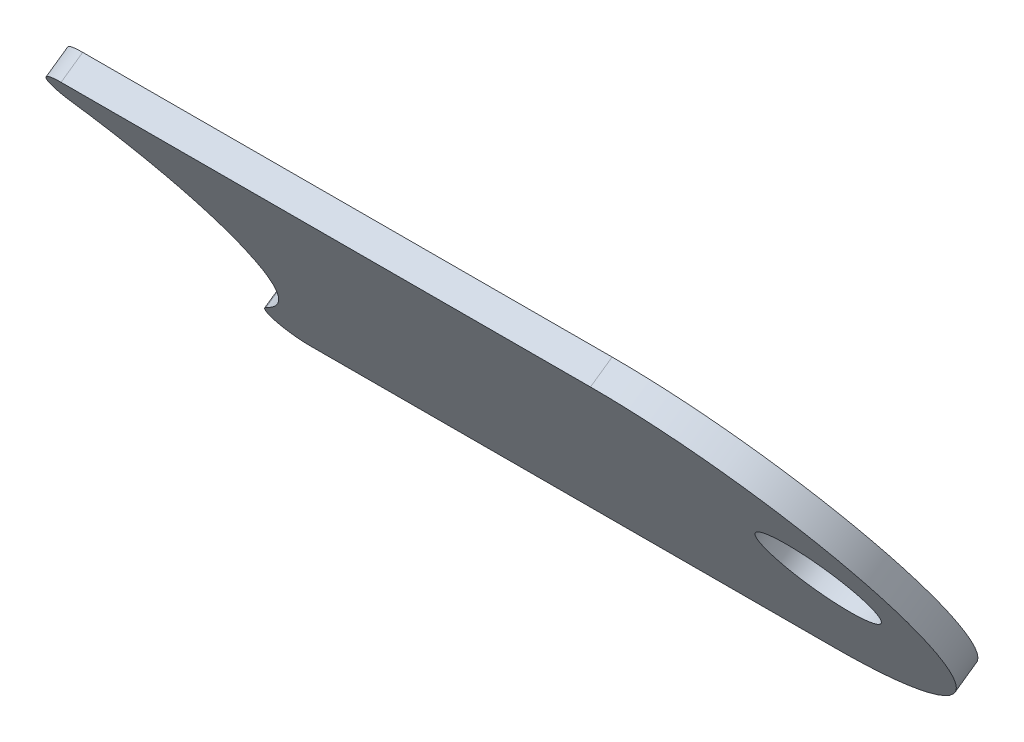
ISO-10303-21;
HEADER;
FILE_DESCRIPTION(('STEP AP214'),'2;1');
FILE_NAME('part.step','',(''),(''),'','','');
FILE_SCHEMA(('AUTOMOTIVE_DESIGN { 1 0 10303 214 1 1 1 1 }'));
ENDSEC;
DATA;
#1=APPLICATION_CONTEXT('core data for automotive mechanical design processes');
#2=APPLICATION_PROTOCOL_DEFINITION('international standard','automotive_design',2000,#1);
#3=PRODUCT_CONTEXT('',#1,'mechanical');
#4=PRODUCT('Part','Part','',(#3));
#5=PRODUCT_RELATED_PRODUCT_CATEGORY('part','',(#4));
#6=PRODUCT_DEFINITION_FORMATION('','',#4);
#7=PRODUCT_DEFINITION_CONTEXT('part definition',#1,'design');
#8=PRODUCT_DEFINITION('design','',#6,#7);
#9=PRODUCT_DEFINITION_SHAPE('','',#8);
#10=(LENGTH_UNIT() NAMED_UNIT(*) SI_UNIT(.MILLI.,.METRE.));
#11=(NAMED_UNIT(*) PLANE_ANGLE_UNIT() SI_UNIT($,.RADIAN.));
#12=(NAMED_UNIT(*) SI_UNIT($,.STERADIAN.) SOLID_ANGLE_UNIT());
#13=UNCERTAINTY_MEASURE_WITH_UNIT(LENGTH_MEASURE(1.E-05),#10,'distance_accuracy_value','');
#14=(GEOMETRIC_REPRESENTATION_CONTEXT(3) GLOBAL_UNCERTAINTY_ASSIGNED_CONTEXT((#13)) GLOBAL_UNIT_ASSIGNED_CONTEXT((#10,
#11,#12)) REPRESENTATION_CONTEXT('',''));
#15=CARTESIAN_POINT('',(0.,0.,0.));
#16=DIRECTION('',(0.,0.,1.));
#17=DIRECTION('',(1.,0.,0.));
#18=AXIS2_PLACEMENT_3D('',#15,#16,#17);
#19=CARTESIAN_POINT('',(369.178005994404,143.93863860398,-371.119079257776));
#20=DIRECTION('',(0.,0.57357643635105,-0.819152044288989));
#21=DIRECTION('',(0.,0.819152044288989,0.57357643635105));
#22=AXIS2_PLACEMENT_3D('',#19,#20,#21);
#23=PLANE('',#22);
#24=DIRECTION('',(-0.999979236342597,-0.00527872685333391,-0.00369620433485562));
#25=VECTOR('',#24,1.);
#26=CARTESIAN_POINT('',(369.25984481726,133.535839655271,-378.403197500141));
#27=LINE('',#26,#25);
#28=CARTESIAN_POINT('',(369.25984481726,133.535839655271,-378.403197500141));
#29=VERTEX_POINT('',#28);
#30=CARTESIAN_POINT('',(337.560977259532,133.368506517426,-378.520365424653));
#31=VERTEX_POINT('',#30);
#32=EDGE_CURVE('E141',#29,#31,#27,.T.);
#33=ORIENTED_EDGE('',*,*,#32,.T.);
#34=CARTESIAN_POINT('',(337.550747194261,134.668883386595,-377.609831738348));
#35=DIRECTION('',(0.,0.57357643635105,-0.819152044288989));
#36=DIRECTION('',(0.,0.819152044288989,0.57357643635105));
#37=AXIS2_PLACEMENT_3D('',#34,#35,#36);
#38=CIRCLE('',#37,1.5875);
#39=CARTESIAN_POINT('',(336.494102412081,135.639382583709,-376.930280884701));
#40=VERTEX_POINT('',#39);
#41=EDGE_CURVE('E219',#31,#40,#38,.T.);
#42=ORIENTED_EDGE('',*,*,#41,.T.);
#43=CARTESIAN_POINT('',(328.095275038634,143.527103450277,-371.407239274637));
#44=DIRECTION('',(0.,0.57357643635105,-0.819152044288989));
#45=DIRECTION('',(-0.0176869954539416,-0.819023906678444,-0.573486713430218));
#46=AXIS2_PLACEMENT_3D('',#43,#44,#45);
#47=ELLIPSE('',#46,12.841585507469,12.7);
#48=CARTESIAN_POINT('',(340.793288413971,143.343101551537,-371.536078791179));
#49=VERTEX_POINT('',#48);
#50=EDGE_CURVE('E123',#49,#40,#47,.T.);
#51=ORIENTED_EDGE('',*,*,#50,.F.);
#52=CARTESIAN_POINT('',(340.794846700172,143.440453597532,-371.467912154752));
#53=VERTEX_POINT('',#52);
#54=EDGE_CURVE('E115',#53,#49,#47,.T.);
#55=ORIENTED_EDGE('',*,*,#54,.F.);
#56=CARTESIAN_POINT('',(328.099479374518,143.721791779883,-371.270917038645));
#57=DIRECTION('',(0.,-0.57357643635105,0.819152044288989));
#58=DIRECTION('',(-0.0176869954539423,-0.819023906678444,-0.573486713430218));
#59=AXIS2_PLACEMENT_3D('',#56,#57,#58);
#60=ELLIPSE('',#59,12.841585507469,12.7);
#61=CARTESIAN_POINT('',(336.135855829977,151.86970256596,-365.565688485574));
#62=VERTEX_POINT('',#61);
#63=EDGE_CURVE('E102',#62,#53,#60,.F.);
#64=ORIENTED_EDGE('',*,*,#63,.F.);
#65=CARTESIAN_POINT('',(337.146776750509,152.872351073607,-364.863626442344));
#66=DIRECTION('',(0.,0.57357643635105,-0.819152044288989));
#67=DIRECTION('',(0.,0.819152044288989,0.57357643635105));
#68=AXIS2_PLACEMENT_3D('',#65,#66,#67);
#69=CIRCLE('',#68,1.5875);
#70=CARTESIAN_POINT('',(337.136546685238,154.172727942776,-363.953092756039));
#71=VERTEX_POINT('',#70);
#72=EDGE_CURVE('E212',#62,#71,#69,.T.);
#73=ORIENTED_EDGE('',*,*,#72,.T.);
#74=DIRECTION('',(0.999979236342597,0.00527872685333337,0.00369620433485488));
#75=VECTOR('',#74,1.);
#76=CARTESIAN_POINT('',(328.099479374518,154.125022742353,-363.986496296987));
#77=LINE('',#76,#75);
#78=CARTESIAN_POINT('',(369.096167171547,154.341437552688,-363.83496101541));
#79=VERTEX_POINT('',#78);
#80=EDGE_CURVE('E136',#71,#79,#77,.T.);
#81=ORIENTED_EDGE('',*,*,#80,.T.);
#82=CARTESIAN_POINT('',(369.178005994404,143.93863860398,-371.119079257776));
#83=DIRECTION('',(0.,0.57357643635105,-0.819152044288989));
#84=DIRECTION('',(0.,0.819152044288989,0.57357643635105));
#85=AXIS2_PLACEMENT_3D('',#82,#83,#84);
#86=CIRCLE('',#85,12.699736301551);
#87=EDGE_CURVE('E138',#79,#29,#86,.T.);
#88=ORIENTED_EDGE('',*,*,#87,.T.);
#89=EDGE_LOOP('',(#33,#42,#51,#55,#64,#73,#81,#88));
#90=FACE_BOUND('',#89,.T.);
#91=CARTESIAN_POINT('',(375.527742298692,143.972157823502,-371.095608847591));
#92=DIRECTION('',(0.,0.57357643635105,-0.819152044288989));
#93=DIRECTION('',(0.,0.819152044288989,0.57357643635105));
#94=AXIS2_PLACEMENT_3D('',#91,#92,#93);
#95=CIRCLE('',#94,3.30200000000005);
#96=CARTESIAN_POINT('',(375.527742298692,146.676997873744,-369.20165945476));
#97=VERTEX_POINT('',#96);
#98=EDGE_CURVE('E127',#97,#97,#95,.T.);
#99=ORIENTED_EDGE('',*,*,#98,.F.);
#100=EDGE_LOOP('',(#99));
#101=FACE_BOUND('',#100,.T.);
#102=ADVANCED_FACE('F38',(#90,#101),#23,.T.);
#103=CARTESIAN_POINT('',(369.178005994404,143.028086011272,-369.818675387467));
#104=DIRECTION('',(0.,0.57357643635105,-0.819152044288989));
#105=DIRECTION('',(0.,0.819152044288989,0.57357643635105));
#106=AXIS2_PLACEMENT_3D('',#103,#104,#105);
#107=PLANE('',#106);
#108=CARTESIAN_POINT('',(328.095275038634,142.61655085757,-370.106835404328));
#109=DIRECTION('',(0.,0.57357643635105,-0.819152044288989));
#110=DIRECTION('',(-0.0176869954539423,-0.819023906678444,-0.573486713430218));
#111=AXIS2_PLACEMENT_3D('',#108,#109,#110);
#112=ELLIPSE('',#111,12.841585507469,12.7);
#113=CARTESIAN_POINT('',(340.794846700172,142.529901004807,-370.167508284417));
#114=VERTEX_POINT('',#113);
#115=CARTESIAN_POINT('',(336.494102412081,134.728829991002,-375.629877014393));
#116=VERTEX_POINT('',#115);
#117=EDGE_CURVE('E110',#114,#116,#112,.T.);
#118=ORIENTED_EDGE('',*,*,#117,.T.);
#119=CARTESIAN_POINT('',(337.550747194261,133.758330793887,-376.309427868039));
#120=DIRECTION('',(0.,0.57357643635105,-0.819152044288989));
#121=DIRECTION('',(0.,0.819152044288989,0.57357643635105));
#122=AXIS2_PLACEMENT_3D('',#119,#120,#121);
#123=CIRCLE('',#122,1.5875);
#124=CARTESIAN_POINT('',(337.560977259532,132.457953924719,-377.219961554344));
#125=VERTEX_POINT('',#124);
#126=EDGE_CURVE('E213',#116,#125,#123,.F.);
#127=ORIENTED_EDGE('',*,*,#126,.T.);
#128=DIRECTION('',(-0.999979236342597,-0.00527872685333391,-0.00369620433485562));
#129=VECTOR('',#128,1.);
#130=CARTESIAN_POINT('',(369.25984481726,132.625287062564,-377.102793629832));
#131=LINE('',#130,#129);
#132=CARTESIAN_POINT('',(369.25984481726,132.625287062564,-377.102793629832));
#133=VERTEX_POINT('',#132);
#134=EDGE_CURVE('E139',#133,#125,#131,.T.);
#135=ORIENTED_EDGE('',*,*,#134,.F.);
#136=CARTESIAN_POINT('',(369.178005994404,143.028086011272,-369.818675387467));
#137=DIRECTION('',(0.,0.57357643635105,-0.819152044288989));
#138=DIRECTION('',(0.,0.819152044288989,0.57357643635105));
#139=AXIS2_PLACEMENT_3D('',#136,#137,#138);
#140=CIRCLE('',#139,12.699736301551);
#141=CARTESIAN_POINT('',(369.096167171547,153.43088495998,-362.534557145101));
#142=VERTEX_POINT('',#141);
#143=EDGE_CURVE('E145',#142,#133,#140,.T.);
#144=ORIENTED_EDGE('',*,*,#143,.F.);
#145=DIRECTION('',(0.999979236342597,0.00527872685333337,0.00369620433485488));
#146=VECTOR('',#145,1.);
#147=CARTESIAN_POINT('',(328.099479374518,153.214470149645,-362.686092426678));
#148=LINE('',#147,#146);
#149=CARTESIAN_POINT('',(337.136546685238,153.262175350068,-362.65268888573));
#150=VERTEX_POINT('',#149);
#151=EDGE_CURVE('E134',#150,#142,#148,.T.);
#152=ORIENTED_EDGE('',*,*,#151,.F.);
#153=CARTESIAN_POINT('',(337.146776750509,151.9617984809,-363.563222572035));
#154=DIRECTION('',(0.,0.57357643635105,-0.819152044288989));
#155=DIRECTION('',(0.,0.819152044288989,0.57357643635105));
#156=AXIS2_PLACEMENT_3D('',#153,#154,#155);
#157=CIRCLE('',#156,1.5875);
#158=CARTESIAN_POINT('',(336.135855829977,150.959149973253,-364.265284615265));
#159=VERTEX_POINT('',#158);
#160=EDGE_CURVE('E53',#150,#159,#157,.F.);
#161=ORIENTED_EDGE('',*,*,#160,.T.);
#162=CARTESIAN_POINT('',(328.099479374518,142.811239187175,-369.970513168336));
#163=DIRECTION('',(0.,0.57357643635105,-0.819152044288989));
#164=DIRECTION('',(-0.0176869954539416,-0.819023906678444,-0.573486713430218));
#165=AXIS2_PLACEMENT_3D('',#162,#163,#164);
#166=ELLIPSE('',#165,12.841585507469,12.7);
#167=CARTESIAN_POINT('',(340.797492749855,142.627237288436,-370.099352684879));
#168=VERTEX_POINT('',#167);
#169=EDGE_CURVE('E129',#159,#168,#166,.T.);
#170=ORIENTED_EDGE('',*,*,#169,.T.);
#171=EDGE_CURVE('E117',#168,#114,#166,.T.);
#172=ORIENTED_EDGE('',*,*,#171,.T.);
#173=EDGE_LOOP('',(#118,#127,#135,#144,#152,#161,#170,#172));
#174=FACE_BOUND('',#173,.T.);
#175=CARTESIAN_POINT('',(375.527742298692,143.061605230795,-369.795204977282));
#176=DIRECTION('',(0.,0.57357643635105,-0.819152044288989));
#177=DIRECTION('',(0.,0.819152044288989,0.57357643635105));
#178=AXIS2_PLACEMENT_3D('',#175,#176,#177);
#179=CIRCLE('',#178,3.30200000000005);
#180=CARTESIAN_POINT('',(375.527742298692,145.766445281037,-367.901255584451));
#181=VERTEX_POINT('',#180);
#182=EDGE_CURVE('E124',#181,#181,#179,.T.);
#183=ORIENTED_EDGE('',*,*,#182,.T.);
#184=EDGE_LOOP('',(#183));
#185=FACE_BOUND('',#184,.T.);
#186=ADVANCED_FACE('F190',(#174,#185),#107,.F.);
#187=CARTESIAN_POINT('',(328.099479374518,154.125022742353,-363.986496296987));
#188=DIRECTION('',(0.00644413560356258,-0.81913503569658,-0.573564526806431));
#189=DIRECTION('',(0.,0.57357643635105,-0.819152044288989));
#190=AXIS2_PLACEMENT_3D('',#187,#188,#189);
#191=PLANE('',#190);
#192=ORIENTED_EDGE('',*,*,#80,.F.);
#193=DIRECTION('',(0.,-0.57357643635105,0.819152044288989));
#194=VECTOR('',#193,1.);
#195=CARTESIAN_POINT('',(337.136546685238,154.172727942776,-363.953092756039));
#196=LINE('',#195,#194);
#197=EDGE_CURVE('E46',#71,#150,#196,.T.);
#198=ORIENTED_EDGE('',*,*,#197,.T.);
#199=ORIENTED_EDGE('',*,*,#151,.T.);
#200=DIRECTION('',(0.,-0.57357643635105,0.819152044288989));
#201=VECTOR('',#200,1.);
#202=CARTESIAN_POINT('',(369.096167171547,154.341437552688,-363.83496101541));
#203=LINE('',#202,#201);
#204=EDGE_CURVE('E151',#79,#142,#203,.T.);
#205=ORIENTED_EDGE('',*,*,#204,.F.);
#206=EDGE_LOOP('',(#192,#198,#199,#205));
#207=FACE_BOUND('',#206,.T.);
#208=ADVANCED_FACE('F194',(#207),#191,.F.);
#209=CARTESIAN_POINT('',(369.178005994404,143.93863860398,-371.119079257776));
#210=DIRECTION('',(0.,-0.57357643635105,0.819152044288989));
#211=DIRECTION('',(0.,-0.819152044288989,-0.57357643635105));
#212=AXIS2_PLACEMENT_3D('',#209,#210,#211);
#213=CYLINDRICAL_SURFACE('',#212,12.699736301551);
#214=ORIENTED_EDGE('',*,*,#143,.T.);
#215=DIRECTION('',(0.,-0.57357643635105,0.819152044288989));
#216=VECTOR('',#215,1.);
#217=CARTESIAN_POINT('',(369.25984481726,133.535839655271,-378.403197500141));
#218=LINE('',#217,#216);
#219=EDGE_CURVE('E143',#29,#133,#218,.T.);
#220=ORIENTED_EDGE('',*,*,#219,.F.);
#221=ORIENTED_EDGE('',*,*,#87,.F.);
#222=ORIENTED_EDGE('',*,*,#204,.T.);
#223=EDGE_LOOP('',(#214,#220,#221,#222));
#224=FACE_BOUND('',#223,.T.);
#225=ADVANCED_FACE('F200',(#224),#213,.T.);
#226=CARTESIAN_POINT('',(369.25984481726,133.535839655271,-378.403197500141));
#227=DIRECTION('',(-0.00644413560356344,0.81913503569658,0.573564526806431));
#228=DIRECTION('',(0.,-0.57357643635105,0.819152044288989));
#229=AXIS2_PLACEMENT_3D('',#226,#227,#228);
#230=PLANE('',#229);
#231=ORIENTED_EDGE('',*,*,#134,.T.);
#232=DIRECTION('',(0.,0.57357643635105,-0.819152044288989));
#233=VECTOR('',#232,1.);
#234=CARTESIAN_POINT('',(337.560977259532,133.368506517426,-378.520365424653));
#235=LINE('',#234,#233);
#236=EDGE_CURVE('E162',#125,#31,#235,.T.);
#237=ORIENTED_EDGE('',*,*,#236,.T.);
#238=ORIENTED_EDGE('',*,*,#32,.F.);
#239=ORIENTED_EDGE('',*,*,#219,.T.);
#240=EDGE_LOOP('',(#231,#237,#238,#239));
#241=FACE_BOUND('',#240,.T.);
#242=ADVANCED_FACE('F197',(#241),#230,.F.);
#243=CARTESIAN_POINT('',(375.527742298692,143.972157823502,-371.095608847591));
#244=DIRECTION('',(0.,-0.57357643635105,0.819152044288989));
#245=DIRECTION('',(0.,-0.819152044288989,-0.57357643635105));
#246=AXIS2_PLACEMENT_3D('',#243,#244,#245);
#247=CYLINDRICAL_SURFACE('',#246,3.30200000000005);
#248=ORIENTED_EDGE('',*,*,#98,.T.);
#249=EDGE_LOOP('',(#248));
#250=FACE_BOUND('',#249,.T.);
#251=ORIENTED_EDGE('',*,*,#182,.F.);
#252=EDGE_LOOP('',(#251));
#253=FACE_BOUND('',#252,.T.);
#254=ADVANCED_FACE('F171',(#250,#253),#247,.F.);
#255=CARTESIAN_POINT('',(328.129432561308,137.711167123265,-359.73476449933));
#256=DIRECTION('',(-0.0026192004914144,0.445966278967788,-0.895045930560221));
#257=DIRECTION('',(0.,0.895049000678082,0.445967808687092));
#258=AXIS2_PLACEMENT_3D('',#255,#256,#257);
#259=CYLINDRICAL_SURFACE('',#258,12.7);
#260=ORIENTED_EDGE('',*,*,#171,.F.);
#261=CARTESIAN_POINT('',(340.794846700172,143.440453597526,-371.467912154743));
#262=CARTESIAN_POINT('',(340.795869173466,143.179789725343,-371.029247667536));
#263=CARTESIAN_POINT('',(340.796724010809,142.919128266473,-370.59058145295));
#264=CARTESIAN_POINT('',(340.797438658828,142.648058572908,-370.134393238372));
#265=CARTESIAN_POINT('',(340.797465838047,142.637647928747,-370.116872963003));
#266=CARTESIAN_POINT('',(340.797492749855,142.627237288436,-370.099352684879));
#267=B_SPLINE_CURVE_WITH_KNOTS('',3,(#261,#262,#263,#264,#265,#266),.UNSPECIFIED.,.F.,.F.,(4,2,
4),(0.,1.53080324416749,1.59194308957113),.UNSPECIFIED.);
#268=EDGE_CURVE('E105',#168,#53,#267,.F.);
#269=ORIENTED_EDGE('',*,*,#268,.T.);
#270=ORIENTED_EDGE('',*,*,#54,.T.);
#271=CARTESIAN_POINT('',(340.79527462416,141.538050713464,-368.498229507492));
#272=CARTESIAN_POINT('',(340.79550188821,142.129311014674,-369.493334117482));
#273=CARTESIAN_POINT('',(340.794866462557,142.720583990935,-370.488430264593));
#274=CARTESIAN_POINT('',(340.793341970224,143.322280274749,-371.501038232233));
#275=CARTESIAN_POINT('',(340.793315325814,143.332690911179,-371.518558513018));
#276=CARTESIAN_POINT('',(340.793288413971,143.343101551537,-371.536078791179));
#277=B_SPLINE_CURVE_WITH_KNOTS('',3,(#271,#272,#273,#274,#275,#276),.UNSPECIFIED.,.F.,.F.,(4,2,
4),(0.,3.47251843824703,3.53365828365068),.UNSPECIFIED.);
#278=EDGE_CURVE('E154',#49,#114,#277,.F.);
#279=ORIENTED_EDGE('',*,*,#278,.T.);
#280=EDGE_LOOP('',(#260,#269,#270,#279));
#281=FACE_BOUND('',#280,.T.);
#282=ADVANCED_FACE('F113',(#281),#259,.F.);
#283=CARTESIAN_POINT('',(328.095275038634,135.703563764816,-360.234066667178));
#284=DIRECTION('',(0.,0.57357643635105,-0.819152044288989));
#285=DIRECTION('',(-0.0176869954539423,-0.819023906678444,-0.573486713430218));
#286=AXIS2_PLACEMENT_3D('',#283,#284,#285);
#287=ELLIPSE('',#286,12.841585507469,12.7);
#288=DIRECTION('',(0.,0.57357643635105,-0.819152044288989));
#289=VECTOR('',#288,1.);
#290=SURFACE_OF_LINEAR_EXTRUSION('',#287,#289);
#291=ORIENTED_EDGE('',*,*,#50,.T.);
#292=DIRECTION('',(0.,0.57357643635105,-0.819152044288989));
#293=VECTOR('',#292,1.);
#294=CARTESIAN_POINT('',(336.494102412081,135.639382583709,-376.930280884701));
#295=LINE('',#294,#293);
#296=EDGE_CURVE('E217',#40,#116,#295,.F.);
#297=ORIENTED_EDGE('',*,*,#296,.T.);
#298=ORIENTED_EDGE('',*,*,#117,.F.);
#299=ORIENTED_EDGE('',*,*,#278,.F.);
#300=EDGE_LOOP('',(#291,#297,#298,#299));
#301=FACE_BOUND('',#300,.T.);
#302=ADVANCED_FACE('F164',(#301),#290,.F.);
#303=CARTESIAN_POINT('',(328.099479374518,150.632735195092,-381.140767101784));
#304=DIRECTION('',(0.,-0.57357643635105,0.819152044288989));
#305=DIRECTION('',(-0.0176869954539423,-0.819023906678444,-0.573486713430218));
#306=AXIS2_PLACEMENT_3D('',#303,#304,#305);
#307=ELLIPSE('',#306,12.841585507469,12.7);
#308=DIRECTION('',(0.,-0.57357643635105,0.819152044288989));
#309=VECTOR('',#308,1.);
#310=SURFACE_OF_LINEAR_EXTRUSION('',#307,#309);
#311=ORIENTED_EDGE('',*,*,#169,.F.);
#312=DIRECTION('',(0.,-0.57357643635105,0.819152044288989));
#313=VECTOR('',#312,1.);
#314=CARTESIAN_POINT('',(336.135855829977,150.959149973253,-364.265284615265));
#315=LINE('',#314,#313);
#316=EDGE_CURVE('E11',#159,#62,#315,.F.);
#317=ORIENTED_EDGE('',*,*,#316,.T.);
#318=ORIENTED_EDGE('',*,*,#63,.T.);
#319=ORIENTED_EDGE('',*,*,#268,.F.);
#320=EDGE_LOOP('',(#311,#317,#318,#319));
#321=FACE_BOUND('',#320,.T.);
#322=ADVANCED_FACE('F104',(#321),#310,.F.);
#323=CARTESIAN_POINT('',(337.550747194261,134.213607090241,-376.959629803193));
#324=DIRECTION('',(0.,0.57357643635105,-0.819152044288989));
#325=DIRECTION('',(0.,0.819152044288989,0.57357643635105));
#326=AXIS2_PLACEMENT_3D('',#323,#324,#325);
#327=CYLINDRICAL_SURFACE('',#326,1.5875);
#328=ORIENTED_EDGE('',*,*,#126,.F.);
#329=ORIENTED_EDGE('',*,*,#296,.F.);
#330=ORIENTED_EDGE('',*,*,#41,.F.);
#331=ORIENTED_EDGE('',*,*,#236,.F.);
#332=EDGE_LOOP('',(#328,#329,#330,#331));
#333=FACE_BOUND('',#332,.T.);
#334=ADVANCED_FACE('F182',(#333),#327,.T.);
#335=CARTESIAN_POINT('',(337.146776750509,152.417074777254,-364.21342450719));
#336=DIRECTION('',(0.,-0.57357643635105,0.819152044288989));
#337=DIRECTION('',(0.,-0.819152044288989,-0.57357643635105));
#338=AXIS2_PLACEMENT_3D('',#335,#336,#337);
#339=CYLINDRICAL_SURFACE('',#338,1.5875);
#340=ORIENTED_EDGE('',*,*,#72,.F.);
#341=ORIENTED_EDGE('',*,*,#316,.F.);
#342=ORIENTED_EDGE('',*,*,#160,.F.);
#343=ORIENTED_EDGE('',*,*,#197,.F.);
#344=EDGE_LOOP('',(#340,#341,#342,#343));
#345=FACE_BOUND('',#344,.T.);
#346=ADVANCED_FACE('F40',(#345),#339,.T.);
#347=CLOSED_SHELL('',(#102,#186,#208,#225,#242,#254,#282,#302,#322,#334,#346));
#348=MANIFOLD_SOLID_BREP('B2',#347);
#349=ADVANCED_BREP_SHAPE_REPRESENTATION('',(#18,#348),#14);
#350=SHAPE_DEFINITION_REPRESENTATION(#9,#349);
ENDSEC;
END-ISO-10303-21;
